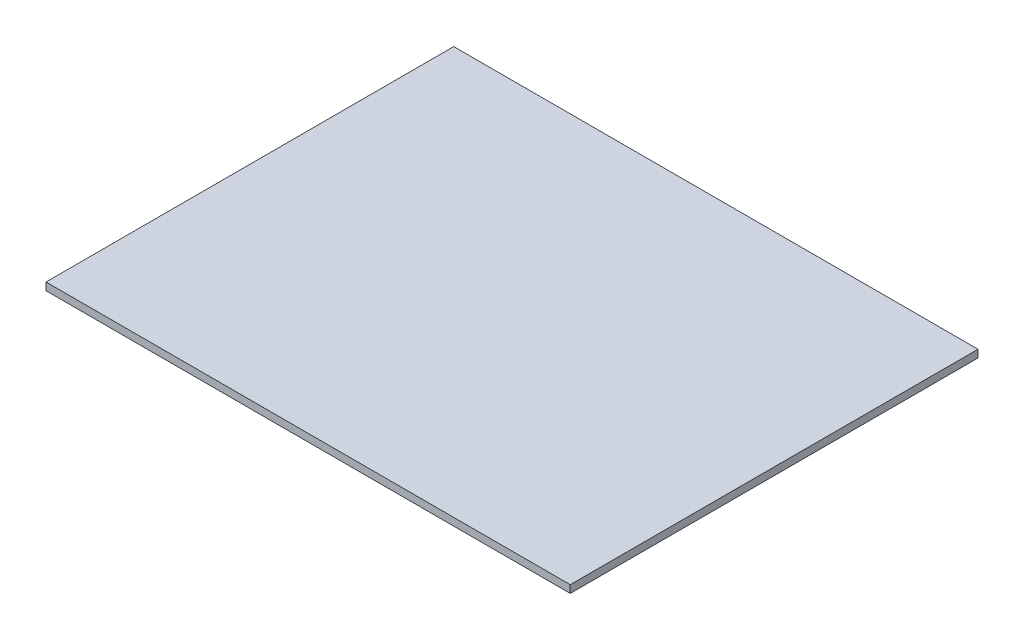
ISO-10303-21;
HEADER;
FILE_DESCRIPTION(('STEP AP214'),'2;1');
FILE_NAME('part.step','',(''),(''),'','','');
FILE_SCHEMA(('AUTOMOTIVE_DESIGN { 1 0 10303 214 1 1 1 1 }'));
ENDSEC;
DATA;
#1=APPLICATION_CONTEXT('core data for automotive mechanical design processes');
#2=APPLICATION_PROTOCOL_DEFINITION('international standard','automotive_design',2000,#1);
#3=PRODUCT_CONTEXT('',#1,'mechanical');
#4=PRODUCT('Part','Part','',(#3));
#5=PRODUCT_RELATED_PRODUCT_CATEGORY('part','',(#4));
#6=PRODUCT_DEFINITION_FORMATION('','',#4);
#7=PRODUCT_DEFINITION_CONTEXT('part definition',#1,'design');
#8=PRODUCT_DEFINITION('design','',#6,#7);
#9=PRODUCT_DEFINITION_SHAPE('','',#8);
#10=(LENGTH_UNIT() NAMED_UNIT(*) SI_UNIT(.MILLI.,.METRE.));
#11=(NAMED_UNIT(*) PLANE_ANGLE_UNIT() SI_UNIT($,.RADIAN.));
#12=(NAMED_UNIT(*) SI_UNIT($,.STERADIAN.) SOLID_ANGLE_UNIT());
#13=UNCERTAINTY_MEASURE_WITH_UNIT(LENGTH_MEASURE(1.E-05),#10,'distance_accuracy_value','');
#14=(GEOMETRIC_REPRESENTATION_CONTEXT(3) GLOBAL_UNCERTAINTY_ASSIGNED_CONTEXT((#13)) GLOBAL_UNIT_ASSIGNED_CONTEXT((#10,
#11,#12)) REPRESENTATION_CONTEXT('',''));
#15=CARTESIAN_POINT('',(0.,0.,0.));
#16=DIRECTION('',(0.,0.,1.));
#17=DIRECTION('',(1.,0.,0.));
#18=AXIS2_PLACEMENT_3D('',#15,#16,#17);
#19=CARTESIAN_POINT('',(0.,0.65,0.));
#20=DIRECTION('',(1.,0.,0.));
#21=DIRECTION('',(0.,0.,-1.));
#22=AXIS2_PLACEMENT_3D('',#19,#20,#21);
#23=PLANE('',#22);
#24=DIRECTION('',(0.,0.,1.));
#25=VECTOR('',#24,1.);
#26=CARTESIAN_POINT('',(0.,0.,0.));
#27=LINE('',#26,#25);
#28=CARTESIAN_POINT('',(0.,0.,-35.));
#29=VERTEX_POINT('',#28);
#30=CARTESIAN_POINT('',(0.,0.,0.));
#31=VERTEX_POINT('',#30);
#32=EDGE_CURVE('E104',#29,#31,#27,.T.);
#33=ORIENTED_EDGE('',*,*,#32,.T.);
#34=DIRECTION('',(0.,-1.,0.));
#35=VECTOR('',#34,1.);
#36=CARTESIAN_POINT('',(0.,0.65,0.));
#37=LINE('',#36,#35);
#38=CARTESIAN_POINT('',(0.,0.65,0.));
#39=VERTEX_POINT('',#38);
#40=EDGE_CURVE('E11',#39,#31,#37,.T.);
#41=ORIENTED_EDGE('',*,*,#40,.F.);
#42=DIRECTION('',(0.,0.,1.));
#43=VECTOR('',#42,1.);
#44=CARTESIAN_POINT('',(0.,0.65,0.));
#45=LINE('',#44,#43);
#46=CARTESIAN_POINT('',(0.,0.65,-35.));
#47=VERTEX_POINT('',#46);
#48=EDGE_CURVE('E92',#47,#39,#45,.T.);
#49=ORIENTED_EDGE('',*,*,#48,.F.);
#50=DIRECTION('',(0.,-1.,0.));
#51=VECTOR('',#50,1.);
#52=CARTESIAN_POINT('',(0.,0.65,-35.));
#53=LINE('',#52,#51);
#54=EDGE_CURVE('E100',#47,#29,#53,.T.);
#55=ORIENTED_EDGE('',*,*,#54,.T.);
#56=EDGE_LOOP('',(#33,#41,#49,#55));
#57=FACE_BOUND('',#56,.T.);
#58=ADVANCED_FACE('F41',(#57),#23,.F.);
#59=CARTESIAN_POINT('',(0.,0.65,0.));
#60=DIRECTION('',(0.,0.,-1.));
#61=DIRECTION('',(-1.,0.,0.));
#62=AXIS2_PLACEMENT_3D('',#59,#60,#61);
#63=PLANE('',#62);
#64=DIRECTION('',(1.,0.,0.));
#65=VECTOR('',#64,1.);
#66=CARTESIAN_POINT('',(0.,0.,0.));
#67=LINE('',#66,#65);
#68=CARTESIAN_POINT('',(45.,0.,0.));
#69=VERTEX_POINT('',#68);
#70=EDGE_CURVE('E96',#31,#69,#67,.T.);
#71=ORIENTED_EDGE('',*,*,#70,.T.);
#72=DIRECTION('',(0.,-1.,0.));
#73=VECTOR('',#72,1.);
#74=CARTESIAN_POINT('',(45.,0.65,0.));
#75=LINE('',#74,#73);
#76=CARTESIAN_POINT('',(45.,0.65,0.));
#77=VERTEX_POINT('',#76);
#78=EDGE_CURVE('E49',#77,#69,#75,.T.);
#79=ORIENTED_EDGE('',*,*,#78,.F.);
#80=DIRECTION('',(1.,0.,0.));
#81=VECTOR('',#80,1.);
#82=CARTESIAN_POINT('',(0.,0.65,0.));
#83=LINE('',#82,#81);
#84=EDGE_CURVE('E87',#39,#77,#83,.T.);
#85=ORIENTED_EDGE('',*,*,#84,.F.);
#86=ORIENTED_EDGE('',*,*,#40,.T.);
#87=EDGE_LOOP('',(#71,#79,#85,#86));
#88=FACE_BOUND('',#87,.T.);
#89=ADVANCED_FACE('F95',(#88),#63,.F.);
#90=CARTESIAN_POINT('',(45.,0.65,0.));
#91=DIRECTION('',(-1.,0.,0.));
#92=DIRECTION('',(0.,0.,1.));
#93=AXIS2_PLACEMENT_3D('',#90,#91,#92);
#94=PLANE('',#93);
#95=DIRECTION('',(0.,0.,-1.));
#96=VECTOR('',#95,1.);
#97=CARTESIAN_POINT('',(45.,0.,0.));
#98=LINE('',#97,#96);
#99=CARTESIAN_POINT('',(45.,0.,-35.));
#100=VERTEX_POINT('',#99);
#101=EDGE_CURVE('E74',#69,#100,#98,.T.);
#102=ORIENTED_EDGE('',*,*,#101,.T.);
#103=DIRECTION('',(0.,-1.,0.));
#104=VECTOR('',#103,1.);
#105=CARTESIAN_POINT('',(45.,0.65,-35.));
#106=LINE('',#105,#104);
#107=CARTESIAN_POINT('',(45.,0.65,-35.));
#108=VERTEX_POINT('',#107);
#109=EDGE_CURVE('E97',#108,#100,#106,.T.);
#110=ORIENTED_EDGE('',*,*,#109,.F.);
#111=DIRECTION('',(0.,0.,-1.));
#112=VECTOR('',#111,1.);
#113=CARTESIAN_POINT('',(45.,0.65,0.));
#114=LINE('',#113,#112);
#115=EDGE_CURVE('E90',#77,#108,#114,.T.);
#116=ORIENTED_EDGE('',*,*,#115,.F.);
#117=ORIENTED_EDGE('',*,*,#78,.T.);
#118=EDGE_LOOP('',(#102,#110,#116,#117));
#119=FACE_BOUND('',#118,.T.);
#120=ADVANCED_FACE('F98',(#119),#94,.F.);
#121=CARTESIAN_POINT('',(0.,0.65,-35.));
#122=DIRECTION('',(0.,0.,1.));
#123=DIRECTION('',(1.,0.,0.));
#124=AXIS2_PLACEMENT_3D('',#121,#122,#123);
#125=PLANE('',#124);
#126=DIRECTION('',(-1.,0.,0.));
#127=VECTOR('',#126,1.);
#128=CARTESIAN_POINT('',(0.,0.,-35.));
#129=LINE('',#128,#127);
#130=EDGE_CURVE('E80',#100,#29,#129,.T.);
#131=ORIENTED_EDGE('',*,*,#130,.T.);
#132=ORIENTED_EDGE('',*,*,#54,.F.);
#133=DIRECTION('',(-1.,0.,0.));
#134=VECTOR('',#133,1.);
#135=CARTESIAN_POINT('',(0.,0.65,-35.));
#136=LINE('',#135,#134);
#137=EDGE_CURVE('E57',#108,#47,#136,.T.);
#138=ORIENTED_EDGE('',*,*,#137,.F.);
#139=ORIENTED_EDGE('',*,*,#109,.T.);
#140=EDGE_LOOP('',(#131,#132,#138,#139));
#141=FACE_BOUND('',#140,.T.);
#142=ADVANCED_FACE('F111',(#141),#125,.F.);
#143=CARTESIAN_POINT('',(0.,0.65,0.));
#144=DIRECTION('',(0.,-1.,0.));
#145=DIRECTION('',(0.,0.,-1.));
#146=AXIS2_PLACEMENT_3D('',#143,#144,#145);
#147=PLANE('',#146);
#148=ORIENTED_EDGE('',*,*,#48,.T.);
#149=ORIENTED_EDGE('',*,*,#84,.T.);
#150=ORIENTED_EDGE('',*,*,#115,.T.);
#151=ORIENTED_EDGE('',*,*,#137,.T.);
#152=EDGE_LOOP('',(#148,#149,#150,#151));
#153=FACE_BOUND('',#152,.T.);
#154=ADVANCED_FACE('F88',(#153),#147,.F.);
#155=CARTESIAN_POINT('',(0.,0.,0.));
#156=DIRECTION('',(0.,-1.,0.));
#157=DIRECTION('',(0.,0.,-1.));
#158=AXIS2_PLACEMENT_3D('',#155,#156,#157);
#159=PLANE('',#158);
#160=ORIENTED_EDGE('',*,*,#32,.F.);
#161=ORIENTED_EDGE('',*,*,#130,.F.);
#162=ORIENTED_EDGE('',*,*,#101,.F.);
#163=ORIENTED_EDGE('',*,*,#70,.F.);
#164=EDGE_LOOP('',(#160,#161,#162,#163));
#165=FACE_BOUND('',#164,.T.);
#166=ADVANCED_FACE('F114',(#165),#159,.T.);
#167=CLOSED_SHELL('',(#58,#89,#120,#142,#154,#166));
#168=MANIFOLD_SOLID_BREP('B2',#167);
#169=ADVANCED_BREP_SHAPE_REPRESENTATION('',(#18,#168),#14);
#170=SHAPE_DEFINITION_REPRESENTATION(#9,#169);
ENDSEC;
END-ISO-10303-21;
